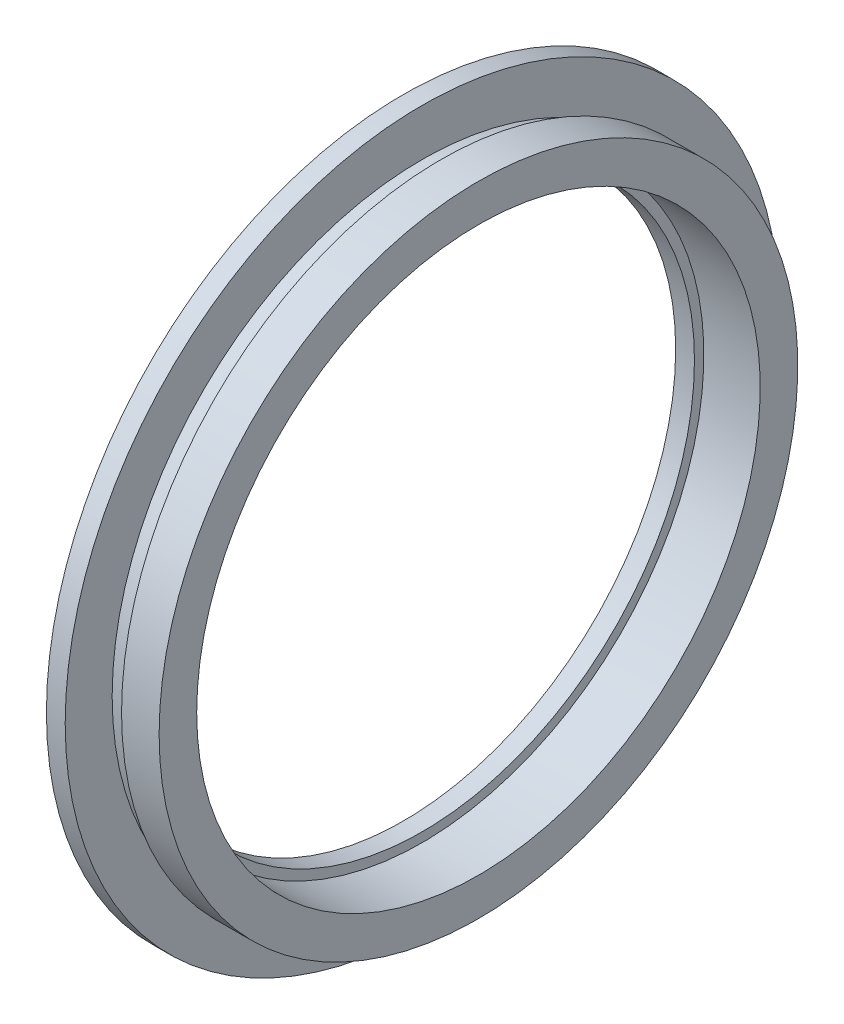
ISO-10303-21;
HEADER;
FILE_DESCRIPTION(('STEP AP214'),'2;1');
FILE_NAME('part.step','',(''),(''),'','','');
FILE_SCHEMA(('AUTOMOTIVE_DESIGN { 1 0 10303 214 1 1 1 1 }'));
ENDSEC;
DATA;
#1=APPLICATION_CONTEXT('core data for automotive mechanical design processes');
#2=APPLICATION_PROTOCOL_DEFINITION('international standard','automotive_design',2000,#1);
#3=PRODUCT_CONTEXT('',#1,'mechanical');
#4=PRODUCT('Part','Part','',(#3));
#5=PRODUCT_RELATED_PRODUCT_CATEGORY('part','',(#4));
#6=PRODUCT_DEFINITION_FORMATION('','',#4);
#7=PRODUCT_DEFINITION_CONTEXT('part definition',#1,'design');
#8=PRODUCT_DEFINITION('design','',#6,#7);
#9=PRODUCT_DEFINITION_SHAPE('','',#8);
#10=(LENGTH_UNIT() NAMED_UNIT(*) SI_UNIT(.MILLI.,.METRE.));
#11=(NAMED_UNIT(*) PLANE_ANGLE_UNIT() SI_UNIT($,.RADIAN.));
#12=(NAMED_UNIT(*) SI_UNIT($,.STERADIAN.) SOLID_ANGLE_UNIT());
#13=UNCERTAINTY_MEASURE_WITH_UNIT(LENGTH_MEASURE(1.E-05),#10,'distance_accuracy_value','');
#14=(GEOMETRIC_REPRESENTATION_CONTEXT(3) GLOBAL_UNCERTAINTY_ASSIGNED_CONTEXT((#13)) GLOBAL_UNIT_ASSIGNED_CONTEXT((#10,
#11,#12)) REPRESENTATION_CONTEXT('',''));
#15=CARTESIAN_POINT('',(0.,0.,0.));
#16=DIRECTION('',(0.,0.,1.));
#17=DIRECTION('',(1.,0.,0.));
#18=AXIS2_PLACEMENT_3D('',#15,#16,#17);
#19=CARTESIAN_POINT('',(0.,14.5,0.));
#20=DIRECTION('',(1.,0.,0.));
#21=DIRECTION('',(0.,0.,-1.));
#22=AXIS2_PLACEMENT_3D('',#19,#20,#21);
#23=PLANE('',#22);
#24=CARTESIAN_POINT('',(0.,0.,0.));
#25=DIRECTION('',(-1.,0.,0.));
#26=DIRECTION('',(0.,0.,1.));
#27=AXIS2_PLACEMENT_3D('',#24,#25,#26);
#28=CIRCLE('',#27,14.5);
#29=CARTESIAN_POINT('',(0.,0.,14.5));
#30=VERTEX_POINT('',#29);
#31=EDGE_CURVE('E65',#30,#30,#28,.T.);
#32=ORIENTED_EDGE('',*,*,#31,.F.);
#33=EDGE_LOOP('',(#32));
#34=FACE_BOUND('',#33,.T.);
#35=CARTESIAN_POINT('',(0.,0.,0.));
#36=DIRECTION('',(-1.,0.,0.));
#37=DIRECTION('',(0.,0.,1.));
#38=AXIS2_PLACEMENT_3D('',#35,#36,#37);
#39=CIRCLE('',#38,19.);
#40=CARTESIAN_POINT('',(0.,0.,19.));
#41=VERTEX_POINT('',#40);
#42=EDGE_CURVE('E10',#41,#41,#39,.T.);
#43=ORIENTED_EDGE('',*,*,#42,.T.);
#44=EDGE_LOOP('',(#43));
#45=FACE_BOUND('',#44,.T.);
#46=ADVANCED_FACE('F31',(#34,#45),#23,.F.);
#47=CARTESIAN_POINT('',(0.,0.,0.));
#48=DIRECTION('',(-1.,0.,0.));
#49=DIRECTION('',(0.,0.,1.));
#50=AXIS2_PLACEMENT_3D('',#47,#48,#49);
#51=CYLINDRICAL_SURFACE('',#50,19.);
#52=ORIENTED_EDGE('',*,*,#42,.F.);
#53=EDGE_LOOP('',(#52));
#54=FACE_BOUND('',#53,.T.);
#55=CARTESIAN_POINT('',(1.,0.,0.));
#56=DIRECTION('',(-1.,0.,0.));
#57=DIRECTION('',(0.,0.,1.));
#58=AXIS2_PLACEMENT_3D('',#55,#56,#57);
#59=CIRCLE('',#58,19.);
#60=CARTESIAN_POINT('',(1.,0.,19.));
#61=VERTEX_POINT('',#60);
#62=EDGE_CURVE('E37',#61,#61,#59,.T.);
#63=ORIENTED_EDGE('',*,*,#62,.T.);
#64=EDGE_LOOP('',(#63));
#65=FACE_BOUND('',#64,.T.);
#66=ADVANCED_FACE('F72',(#54,#65),#51,.T.);
#67=CARTESIAN_POINT('',(1.,19.,0.));
#68=DIRECTION('',(-1.,0.,0.));
#69=DIRECTION('',(0.,0.,1.));
#70=AXIS2_PLACEMENT_3D('',#67,#68,#69);
#71=PLANE('',#70);
#72=ORIENTED_EDGE('',*,*,#62,.F.);
#73=EDGE_LOOP('',(#72));
#74=FACE_BOUND('',#73,.T.);
#75=CARTESIAN_POINT('',(1.,0.,0.));
#76=DIRECTION('',(-1.,0.,0.));
#77=DIRECTION('',(0.,0.,1.));
#78=AXIS2_PLACEMENT_3D('',#75,#76,#77);
#79=CIRCLE('',#78,16.5);
#80=CARTESIAN_POINT('',(1.,0.,16.5));
#81=VERTEX_POINT('',#80);
#82=EDGE_CURVE('E41',#81,#81,#79,.T.);
#83=ORIENTED_EDGE('',*,*,#82,.T.);
#84=EDGE_LOOP('',(#83));
#85=FACE_BOUND('',#84,.T.);
#86=ADVANCED_FACE('F76',(#74,#85),#71,.F.);
#87=CARTESIAN_POINT('',(0.,0.,0.));
#88=DIRECTION('',(-1.,0.,0.));
#89=DIRECTION('',(0.,0.,1.));
#90=AXIS2_PLACEMENT_3D('',#87,#88,#89);
#91=CYLINDRICAL_SURFACE('',#90,16.5);
#92=ORIENTED_EDGE('',*,*,#82,.F.);
#93=EDGE_LOOP('',(#92));
#94=FACE_BOUND('',#93,.T.);
#95=CARTESIAN_POINT('',(2.,0.,0.));
#96=DIRECTION('',(-1.,0.,0.));
#97=DIRECTION('',(0.,0.,1.));
#98=AXIS2_PLACEMENT_3D('',#95,#96,#97);
#99=CIRCLE('',#98,16.5);
#100=CARTESIAN_POINT('',(2.,0.,16.5));
#101=VERTEX_POINT('',#100);
#102=EDGE_CURVE('E45',#101,#101,#99,.T.);
#103=ORIENTED_EDGE('',*,*,#102,.T.);
#104=EDGE_LOOP('',(#103));
#105=FACE_BOUND('',#104,.T.);
#106=ADVANCED_FACE('F81',(#94,#105),#91,.T.);
#107=CARTESIAN_POINT('',(2.,16.5,0.));
#108=DIRECTION('',(1.,0.,0.));
#109=DIRECTION('',(0.,0.,-1.));
#110=AXIS2_PLACEMENT_3D('',#107,#108,#109);
#111=PLANE('',#110);
#112=ORIENTED_EDGE('',*,*,#102,.F.);
#113=EDGE_LOOP('',(#112));
#114=FACE_BOUND('',#113,.T.);
#115=CARTESIAN_POINT('',(2.,0.,0.));
#116=DIRECTION('',(-1.,0.,0.));
#117=DIRECTION('',(0.,0.,1.));
#118=AXIS2_PLACEMENT_3D('',#115,#116,#117);
#119=CIRCLE('',#118,17.);
#120=CARTESIAN_POINT('',(2.,0.,17.));
#121=VERTEX_POINT('',#120);
#122=EDGE_CURVE('E50',#121,#121,#119,.T.);
#123=ORIENTED_EDGE('',*,*,#122,.T.);
#124=EDGE_LOOP('',(#123));
#125=FACE_BOUND('',#124,.T.);
#126=ADVANCED_FACE('F87',(#114,#125),#111,.F.);
#127=CARTESIAN_POINT('',(0.,0.,0.));
#128=DIRECTION('',(-1.,0.,0.));
#129=DIRECTION('',(0.,0.,1.));
#130=AXIS2_PLACEMENT_3D('',#127,#128,#129);
#131=CYLINDRICAL_SURFACE('',#130,17.);
#132=ORIENTED_EDGE('',*,*,#122,.F.);
#133=EDGE_LOOP('',(#132));
#134=FACE_BOUND('',#133,.T.);
#135=CARTESIAN_POINT('',(4.,0.,0.));
#136=DIRECTION('',(-1.,0.,0.));
#137=DIRECTION('',(0.,0.,1.));
#138=AXIS2_PLACEMENT_3D('',#135,#136,#137);
#139=CIRCLE('',#138,17.);
#140=CARTESIAN_POINT('',(4.,0.,17.));
#141=VERTEX_POINT('',#140);
#142=EDGE_CURVE('E53',#141,#141,#139,.T.);
#143=ORIENTED_EDGE('',*,*,#142,.T.);
#144=EDGE_LOOP('',(#143));
#145=FACE_BOUND('',#144,.T.);
#146=ADVANCED_FACE('F91',(#134,#145),#131,.T.);
#147=CARTESIAN_POINT('',(4.,17.,0.));
#148=DIRECTION('',(-1.,0.,0.));
#149=DIRECTION('',(0.,0.,1.));
#150=AXIS2_PLACEMENT_3D('',#147,#148,#149);
#151=PLANE('',#150);
#152=ORIENTED_EDGE('',*,*,#142,.F.);
#153=EDGE_LOOP('',(#152));
#154=FACE_BOUND('',#153,.T.);
#155=CARTESIAN_POINT('',(4.,0.,0.));
#156=DIRECTION('',(-1.,0.,0.));
#157=DIRECTION('',(0.,0.,1.));
#158=AXIS2_PLACEMENT_3D('',#155,#156,#157);
#159=CIRCLE('',#158,15.);
#160=CARTESIAN_POINT('',(4.,0.,15.));
#161=VERTEX_POINT('',#160);
#162=EDGE_CURVE('E56',#161,#161,#159,.T.);
#163=ORIENTED_EDGE('',*,*,#162,.T.);
#164=EDGE_LOOP('',(#163));
#165=FACE_BOUND('',#164,.T.);
#166=ADVANCED_FACE('F95',(#154,#165),#151,.F.);
#167=CARTESIAN_POINT('',(0.,0.,0.));
#168=DIRECTION('',(-1.,0.,0.));
#169=DIRECTION('',(0.,0.,1.));
#170=AXIS2_PLACEMENT_3D('',#167,#168,#169);
#171=CYLINDRICAL_SURFACE('',#170,15.);
#172=ORIENTED_EDGE('',*,*,#162,.F.);
#173=EDGE_LOOP('',(#172));
#174=FACE_BOUND('',#173,.T.);
#175=CARTESIAN_POINT('',(1.,0.,0.));
#176=DIRECTION('',(-1.,0.,0.));
#177=DIRECTION('',(0.,0.,1.));
#178=AXIS2_PLACEMENT_3D('',#175,#176,#177);
#179=CIRCLE('',#178,15.);
#180=CARTESIAN_POINT('',(1.,0.,15.));
#181=VERTEX_POINT('',#180);
#182=EDGE_CURVE('E59',#181,#181,#179,.T.);
#183=ORIENTED_EDGE('',*,*,#182,.T.);
#184=EDGE_LOOP('',(#183));
#185=FACE_BOUND('',#184,.T.);
#186=ADVANCED_FACE('F99',(#174,#185),#171,.F.);
#187=CARTESIAN_POINT('',(1.,14.5,0.));
#188=DIRECTION('',(-1.,0.,0.));
#189=DIRECTION('',(0.,0.,1.));
#190=AXIS2_PLACEMENT_3D('',#187,#188,#189);
#191=PLANE('',#190);
#192=ORIENTED_EDGE('',*,*,#182,.F.);
#193=EDGE_LOOP('',(#192));
#194=FACE_BOUND('',#193,.T.);
#195=CARTESIAN_POINT('',(1.,0.,0.));
#196=DIRECTION('',(-1.,0.,0.));
#197=DIRECTION('',(0.,0.,1.));
#198=AXIS2_PLACEMENT_3D('',#195,#196,#197);
#199=CIRCLE('',#198,14.5);
#200=CARTESIAN_POINT('',(1.,0.,14.5));
#201=VERTEX_POINT('',#200);
#202=EDGE_CURVE('E62',#201,#201,#199,.T.);
#203=ORIENTED_EDGE('',*,*,#202,.T.);
#204=EDGE_LOOP('',(#203));
#205=FACE_BOUND('',#204,.T.);
#206=ADVANCED_FACE('F103',(#194,#205),#191,.F.);
#207=CARTESIAN_POINT('',(0.,0.,0.));
#208=DIRECTION('',(-1.,0.,0.));
#209=DIRECTION('',(0.,0.,1.));
#210=AXIS2_PLACEMENT_3D('',#207,#208,#209);
#211=CYLINDRICAL_SURFACE('',#210,14.5);
#212=ORIENTED_EDGE('',*,*,#202,.F.);
#213=EDGE_LOOP('',(#212));
#214=FACE_BOUND('',#213,.T.);
#215=ORIENTED_EDGE('',*,*,#31,.T.);
#216=EDGE_LOOP('',(#215));
#217=FACE_BOUND('',#216,.T.);
#218=ADVANCED_FACE('F69',(#214,#217),#211,.F.);
#219=CLOSED_SHELL('',(#46,#66,#86,#106,#126,#146,#166,#186,#206,#218));
#220=MANIFOLD_SOLID_BREP('B2',#219);
#221=ADVANCED_BREP_SHAPE_REPRESENTATION('',(#18,#220),#14);
#222=SHAPE_DEFINITION_REPRESENTATION(#9,#221);
ENDSEC;
END-ISO-10303-21;
